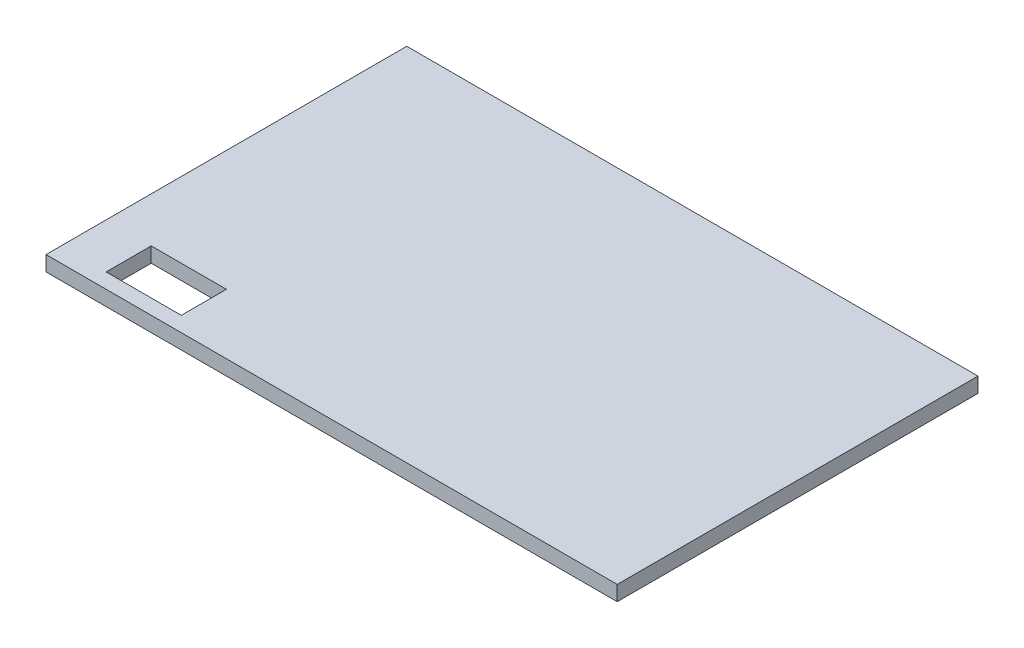
ISO-10303-21;
HEADER;
FILE_DESCRIPTION(('STEP AP214'),'2;1');
FILE_NAME('part.step','',(''),(''),'','','');
FILE_SCHEMA(('AUTOMOTIVE_DESIGN { 1 0 10303 214 1 1 1 1 }'));
ENDSEC;
DATA;
#1=APPLICATION_CONTEXT('core data for automotive mechanical design processes');
#2=APPLICATION_PROTOCOL_DEFINITION('international standard','automotive_design',2000,#1);
#3=PRODUCT_CONTEXT('',#1,'mechanical');
#4=PRODUCT('Part','Part','',(#3));
#5=PRODUCT_RELATED_PRODUCT_CATEGORY('part','',(#4));
#6=PRODUCT_DEFINITION_FORMATION('','',#4);
#7=PRODUCT_DEFINITION_CONTEXT('part definition',#1,'design');
#8=PRODUCT_DEFINITION('design','',#6,#7);
#9=PRODUCT_DEFINITION_SHAPE('','',#8);
#10=(LENGTH_UNIT() NAMED_UNIT(*) SI_UNIT(.MILLI.,.METRE.));
#11=(NAMED_UNIT(*) PLANE_ANGLE_UNIT() SI_UNIT($,.RADIAN.));
#12=(NAMED_UNIT(*) SI_UNIT($,.STERADIAN.) SOLID_ANGLE_UNIT());
#13=UNCERTAINTY_MEASURE_WITH_UNIT(LENGTH_MEASURE(1.E-05),#10,'distance_accuracy_value','');
#14=(GEOMETRIC_REPRESENTATION_CONTEXT(3) GLOBAL_UNCERTAINTY_ASSIGNED_CONTEXT((#13)) GLOBAL_UNIT_ASSIGNED_CONTEXT((#10,
#11,#12)) REPRESENTATION_CONTEXT('',''));
#15=CARTESIAN_POINT('',(0.,0.,0.));
#16=DIRECTION('',(0.,0.,1.));
#17=DIRECTION('',(1.,0.,0.));
#18=AXIS2_PLACEMENT_3D('',#15,#16,#17);
#19=CARTESIAN_POINT('',(0.,2.,0.));
#20=DIRECTION('',(0.,0.,-1.));
#21=DIRECTION('',(-1.,0.,0.));
#22=AXIS2_PLACEMENT_3D('',#19,#20,#21);
#23=PLANE('',#22);
#24=DIRECTION('',(1.,0.,0.));
#25=VECTOR('',#24,1.);
#26=CARTESIAN_POINT('',(0.,1.,0.));
#27=LINE('',#26,#25);
#28=CARTESIAN_POINT('',(0.,1.,0.));
#29=VERTEX_POINT('',#28);
#30=CARTESIAN_POINT('',(38.,1.,0.));
#31=VERTEX_POINT('',#30);
#32=EDGE_CURVE('E62',#29,#31,#27,.T.);
#33=ORIENTED_EDGE('',*,*,#32,.F.);
#34=DIRECTION('',(0.,-1.,0.));
#35=VECTOR('',#34,1.);
#36=CARTESIAN_POINT('',(0.,2.,0.));
#37=LINE('',#36,#35);
#38=CARTESIAN_POINT('',(0.,0.,0.));
#39=VERTEX_POINT('',#38);
#40=EDGE_CURVE('E55',#29,#39,#37,.T.);
#41=ORIENTED_EDGE('',*,*,#40,.T.);
#42=DIRECTION('',(1.,0.,0.));
#43=VECTOR('',#42,1.);
#44=CARTESIAN_POINT('',(0.,0.,0.));
#45=LINE('',#44,#43);
#46=CARTESIAN_POINT('',(38.,0.,0.));
#47=VERTEX_POINT('',#46);
#48=EDGE_CURVE('E138',#39,#47,#45,.T.);
#49=ORIENTED_EDGE('',*,*,#48,.T.);
#50=DIRECTION('',(0.,-1.,0.));
#51=VECTOR('',#50,1.);
#52=CARTESIAN_POINT('',(38.,10.,0.));
#53=LINE('',#52,#51);
#54=EDGE_CURVE('E122',#31,#47,#53,.T.);
#55=ORIENTED_EDGE('',*,*,#54,.F.);
#56=EDGE_LOOP('',(#33,#41,#49,#55));
#57=FACE_BOUND('',#56,.T.);
#58=ADVANCED_FACE('F46',(#57),#23,.F.);
#59=CARTESIAN_POINT('',(0.,2.,-24.));
#60=DIRECTION('',(0.,0.,1.));
#61=DIRECTION('',(1.,0.,0.));
#62=AXIS2_PLACEMENT_3D('',#59,#60,#61);
#63=PLANE('',#62);
#64=DIRECTION('',(-1.,0.,0.));
#65=VECTOR('',#64,1.);
#66=CARTESIAN_POINT('',(0.,1.,-24.));
#67=LINE('',#66,#65);
#68=CARTESIAN_POINT('',(38.,1.,-24.));
#69=VERTEX_POINT('',#68);
#70=CARTESIAN_POINT('',(0.,1.,-24.));
#71=VERTEX_POINT('',#70);
#72=EDGE_CURVE('E112',#69,#71,#67,.T.);
#73=ORIENTED_EDGE('',*,*,#72,.F.);
#74=DIRECTION('',(0.,1.,0.));
#75=VECTOR('',#74,1.);
#76=CARTESIAN_POINT('',(38.,10.,-24.));
#77=LINE('',#76,#75);
#78=CARTESIAN_POINT('',(38.,0.,-24.));
#79=VERTEX_POINT('',#78);
#80=EDGE_CURVE('E162',#79,#69,#77,.T.);
#81=ORIENTED_EDGE('',*,*,#80,.F.);
#82=DIRECTION('',(-1.,0.,0.));
#83=VECTOR('',#82,1.);
#84=CARTESIAN_POINT('',(0.,0.,-24.));
#85=LINE('',#84,#83);
#86=CARTESIAN_POINT('',(0.,0.,-24.));
#87=VERTEX_POINT('',#86);
#88=EDGE_CURVE('E132',#79,#87,#85,.T.);
#89=ORIENTED_EDGE('',*,*,#88,.T.);
#90=DIRECTION('',(0.,-1.,0.));
#91=VECTOR('',#90,1.);
#92=CARTESIAN_POINT('',(0.,2.,-24.));
#93=LINE('',#92,#91);
#94=EDGE_CURVE('E130',#71,#87,#93,.T.);
#95=ORIENTED_EDGE('',*,*,#94,.F.);
#96=EDGE_LOOP('',(#73,#81,#89,#95));
#97=FACE_BOUND('',#96,.T.);
#98=ADVANCED_FACE('F197',(#97),#63,.F.);
#99=CARTESIAN_POINT('',(3.,10.,-1.));
#100=DIRECTION('',(0.,0.,-1.));
#101=DIRECTION('',(-1.,0.,0.));
#102=AXIS2_PLACEMENT_3D('',#99,#100,#101);
#103=PLANE('',#102);
#104=DIRECTION('',(0.,1.,0.));
#105=VECTOR('',#104,1.);
#106=CARTESIAN_POINT('',(3.,0.,-1.));
#107=LINE('',#106,#105);
#108=CARTESIAN_POINT('',(3.,0.,-1.));
#109=VERTEX_POINT('',#108);
#110=CARTESIAN_POINT('',(3.,1.,-1.));
#111=VERTEX_POINT('',#110);
#112=EDGE_CURVE('E171',#109,#111,#107,.T.);
#113=ORIENTED_EDGE('',*,*,#112,.T.);
#114=DIRECTION('',(1.,0.,0.));
#115=VECTOR('',#114,1.);
#116=CARTESIAN_POINT('',(3.,1.,-1.));
#117=LINE('',#116,#115);
#118=CARTESIAN_POINT('',(8.,1.,-1.));
#119=VERTEX_POINT('',#118);
#120=EDGE_CURVE('E69',#111,#119,#117,.T.);
#121=ORIENTED_EDGE('',*,*,#120,.T.);
#122=DIRECTION('',(0.,1.,0.));
#123=VECTOR('',#122,1.);
#124=CARTESIAN_POINT('',(8.,0.,-1.));
#125=LINE('',#124,#123);
#126=CARTESIAN_POINT('',(8.,0.,-1.));
#127=VERTEX_POINT('',#126);
#128=EDGE_CURVE('E144',#127,#119,#125,.T.);
#129=ORIENTED_EDGE('',*,*,#128,.F.);
#130=DIRECTION('',(1.,0.,0.));
#131=VECTOR('',#130,1.);
#132=CARTESIAN_POINT('',(4.,0.,-1.));
#133=LINE('',#132,#131);
#134=EDGE_CURVE('E158',#109,#127,#133,.T.);
#135=ORIENTED_EDGE('',*,*,#134,.F.);
#136=EDGE_LOOP('',(#113,#121,#129,#135));
#137=FACE_BOUND('',#136,.T.);
#138=ADVANCED_FACE('F220',(#137),#103,.T.);
#139=CARTESIAN_POINT('',(0.,2.,0.));
#140=DIRECTION('',(1.,0.,0.));
#141=DIRECTION('',(0.,0.,-1.));
#142=AXIS2_PLACEMENT_3D('',#139,#140,#141);
#143=PLANE('',#142);
#144=DIRECTION('',(0.,0.,1.));
#145=VECTOR('',#144,1.);
#146=CARTESIAN_POINT('',(0.,1.,-24.));
#147=LINE('',#146,#145);
#148=EDGE_CURVE('E109',#71,#29,#147,.T.);
#149=ORIENTED_EDGE('',*,*,#148,.F.);
#150=ORIENTED_EDGE('',*,*,#94,.T.);
#151=DIRECTION('',(0.,0.,1.));
#152=VECTOR('',#151,1.);
#153=CARTESIAN_POINT('',(0.,0.,0.));
#154=LINE('',#153,#152);
#155=EDGE_CURVE('E128',#87,#39,#154,.T.);
#156=ORIENTED_EDGE('',*,*,#155,.T.);
#157=ORIENTED_EDGE('',*,*,#40,.F.);
#158=EDGE_LOOP('',(#149,#150,#156,#157));
#159=FACE_BOUND('',#158,.T.);
#160=ADVANCED_FACE('F48',(#159),#143,.F.);
#161=CARTESIAN_POINT('',(4.,0.,-4.));
#162=DIRECTION('',(0.,0.,-1.));
#163=DIRECTION('',(-1.,0.,0.));
#164=AXIS2_PLACEMENT_3D('',#161,#162,#163);
#165=PLANE('',#164);
#166=DIRECTION('',(1.,0.,0.));
#167=VECTOR('',#166,1.);
#168=CARTESIAN_POINT('',(4.,1.,-4.));
#169=LINE('',#168,#167);
#170=CARTESIAN_POINT('',(3.,1.,-4.));
#171=VERTEX_POINT('',#170);
#172=CARTESIAN_POINT('',(8.,1.,-4.));
#173=VERTEX_POINT('',#172);
#174=EDGE_CURVE('E188',#171,#173,#169,.T.);
#175=ORIENTED_EDGE('',*,*,#174,.F.);
#176=DIRECTION('',(0.,1.,0.));
#177=VECTOR('',#176,1.);
#178=CARTESIAN_POINT('',(3.,0.,-4.));
#179=LINE('',#178,#177);
#180=CARTESIAN_POINT('',(3.,0.,-4.));
#181=VERTEX_POINT('',#180);
#182=EDGE_CURVE('E172',#181,#171,#179,.T.);
#183=ORIENTED_EDGE('',*,*,#182,.F.);
#184=DIRECTION('',(-1.,0.,0.));
#185=VECTOR('',#184,1.);
#186=CARTESIAN_POINT('',(4.,0.,-4.));
#187=LINE('',#186,#185);
#188=CARTESIAN_POINT('',(8.,0.,-4.));
#189=VERTEX_POINT('',#188);
#190=EDGE_CURVE('E148',#189,#181,#187,.T.);
#191=ORIENTED_EDGE('',*,*,#190,.F.);
#192=DIRECTION('',(0.,1.,0.));
#193=VECTOR('',#192,1.);
#194=CARTESIAN_POINT('',(8.,0.,-4.));
#195=LINE('',#194,#193);
#196=EDGE_CURVE('E143',#189,#173,#195,.T.);
#197=ORIENTED_EDGE('',*,*,#196,.T.);
#198=EDGE_LOOP('',(#175,#183,#191,#197));
#199=FACE_BOUND('',#198,.T.);
#200=ADVANCED_FACE('F228',(#199),#165,.F.);
#201=CARTESIAN_POINT('',(8.,0.,-1.));
#202=DIRECTION('',(1.,0.,0.));
#203=DIRECTION('',(0.,0.,-1.));
#204=AXIS2_PLACEMENT_3D('',#201,#202,#203);
#205=PLANE('',#204);
#206=DIRECTION('',(0.,0.,1.));
#207=VECTOR('',#206,1.);
#208=CARTESIAN_POINT('',(8.,1.,-1.));
#209=LINE('',#208,#207);
#210=EDGE_CURVE('E183',#173,#119,#209,.T.);
#211=ORIENTED_EDGE('',*,*,#210,.F.);
#212=ORIENTED_EDGE('',*,*,#196,.F.);
#213=DIRECTION('',(0.,0.,-1.));
#214=VECTOR('',#213,1.);
#215=CARTESIAN_POINT('',(8.,0.,-1.));
#216=LINE('',#215,#214);
#217=EDGE_CURVE('E154',#127,#189,#216,.T.);
#218=ORIENTED_EDGE('',*,*,#217,.F.);
#219=ORIENTED_EDGE('',*,*,#128,.T.);
#220=EDGE_LOOP('',(#211,#212,#218,#219));
#221=FACE_BOUND('',#220,.T.);
#222=ADVANCED_FACE('F230',(#221),#205,.F.);
#223=CARTESIAN_POINT('',(38.,0.,0.));
#224=DIRECTION('',(1.,0.,0.));
#225=DIRECTION('',(0.,0.,-1.));
#226=AXIS2_PLACEMENT_3D('',#223,#224,#225);
#227=PLANE('',#226);
#228=ORIENTED_EDGE('',*,*,#80,.T.);
#229=DIRECTION('',(0.,0.,-1.));
#230=VECTOR('',#229,1.);
#231=CARTESIAN_POINT('',(38.,1.,-24.));
#232=LINE('',#231,#230);
#233=EDGE_CURVE('E124',#31,#69,#232,.T.);
#234=ORIENTED_EDGE('',*,*,#233,.F.);
#235=ORIENTED_EDGE('',*,*,#54,.T.);
#236=DIRECTION('',(0.,0.,-1.));
#237=VECTOR('',#236,1.);
#238=CARTESIAN_POINT('',(38.,0.,0.));
#239=LINE('',#238,#237);
#240=EDGE_CURVE('E166',#47,#79,#239,.T.);
#241=ORIENTED_EDGE('',*,*,#240,.T.);
#242=EDGE_LOOP('',(#228,#234,#235,#241));
#243=FACE_BOUND('',#242,.T.);
#244=ADVANCED_FACE('F199',(#243),#227,.T.);
#245=CARTESIAN_POINT('',(3.,0.,-4.));
#246=DIRECTION('',(-1.,0.,0.));
#247=DIRECTION('',(0.,0.,1.));
#248=AXIS2_PLACEMENT_3D('',#245,#246,#247);
#249=PLANE('',#248);
#250=DIRECTION('',(0.,0.,-1.));
#251=VECTOR('',#250,1.);
#252=CARTESIAN_POINT('',(3.,1.,-4.));
#253=LINE('',#252,#251);
#254=EDGE_CURVE('E11',#111,#171,#253,.T.);
#255=ORIENTED_EDGE('',*,*,#254,.F.);
#256=ORIENTED_EDGE('',*,*,#112,.F.);
#257=DIRECTION('',(0.,0.,1.));
#258=VECTOR('',#257,1.);
#259=CARTESIAN_POINT('',(3.,0.,-4.));
#260=LINE('',#259,#258);
#261=EDGE_CURVE('E176',#181,#109,#260,.T.);
#262=ORIENTED_EDGE('',*,*,#261,.F.);
#263=ORIENTED_EDGE('',*,*,#182,.T.);
#264=EDGE_LOOP('',(#255,#256,#262,#263));
#265=FACE_BOUND('',#264,.T.);
#266=ADVANCED_FACE('F204',(#265),#249,.F.);
#267=CARTESIAN_POINT('',(0.,0.,0.));
#268=DIRECTION('',(0.,-1.,0.));
#269=DIRECTION('',(0.,0.,-1.));
#270=AXIS2_PLACEMENT_3D('',#267,#268,#269);
#271=PLANE('',#270);
#272=ORIENTED_EDGE('',*,*,#261,.T.);
#273=ORIENTED_EDGE('',*,*,#134,.T.);
#274=ORIENTED_EDGE('',*,*,#217,.T.);
#275=ORIENTED_EDGE('',*,*,#190,.T.);
#276=EDGE_LOOP('',(#272,#273,#274,#275));
#277=FACE_BOUND('',#276,.T.);
#278=ORIENTED_EDGE('',*,*,#88,.F.);
#279=ORIENTED_EDGE('',*,*,#240,.F.);
#280=ORIENTED_EDGE('',*,*,#48,.F.);
#281=ORIENTED_EDGE('',*,*,#155,.F.);
#282=EDGE_LOOP('',(#278,#279,#280,#281));
#283=FACE_BOUND('',#282,.T.);
#284=ADVANCED_FACE('F202',(#277,#283),#271,.T.);
#285=CARTESIAN_POINT('',(0.,1.,0.));
#286=DIRECTION('',(0.,1.,0.));
#287=DIRECTION('',(0.,0.,1.));
#288=AXIS2_PLACEMENT_3D('',#285,#286,#287);
#289=PLANE('',#288);
#290=ORIENTED_EDGE('',*,*,#148,.T.);
#291=ORIENTED_EDGE('',*,*,#32,.T.);
#292=ORIENTED_EDGE('',*,*,#233,.T.);
#293=ORIENTED_EDGE('',*,*,#72,.T.);
#294=EDGE_LOOP('',(#290,#291,#292,#293));
#295=FACE_BOUND('',#294,.T.);
#296=ORIENTED_EDGE('',*,*,#210,.T.);
#297=ORIENTED_EDGE('',*,*,#120,.F.);
#298=ORIENTED_EDGE('',*,*,#254,.T.);
#299=ORIENTED_EDGE('',*,*,#174,.T.);
#300=EDGE_LOOP('',(#296,#297,#298,#299));
#301=FACE_BOUND('',#300,.T.);
#302=ADVANCED_FACE('F110',(#295,#301),#289,.T.);
#303=CLOSED_SHELL('',(#58,#98,#138,#160,#200,#222,#244,#266,#284,#302));
#304=MANIFOLD_SOLID_BREP('B2',#303);
#305=ADVANCED_BREP_SHAPE_REPRESENTATION('',(#18,#304),#14);
#306=SHAPE_DEFINITION_REPRESENTATION(#9,#305);
ENDSEC;
END-ISO-10303-21;
